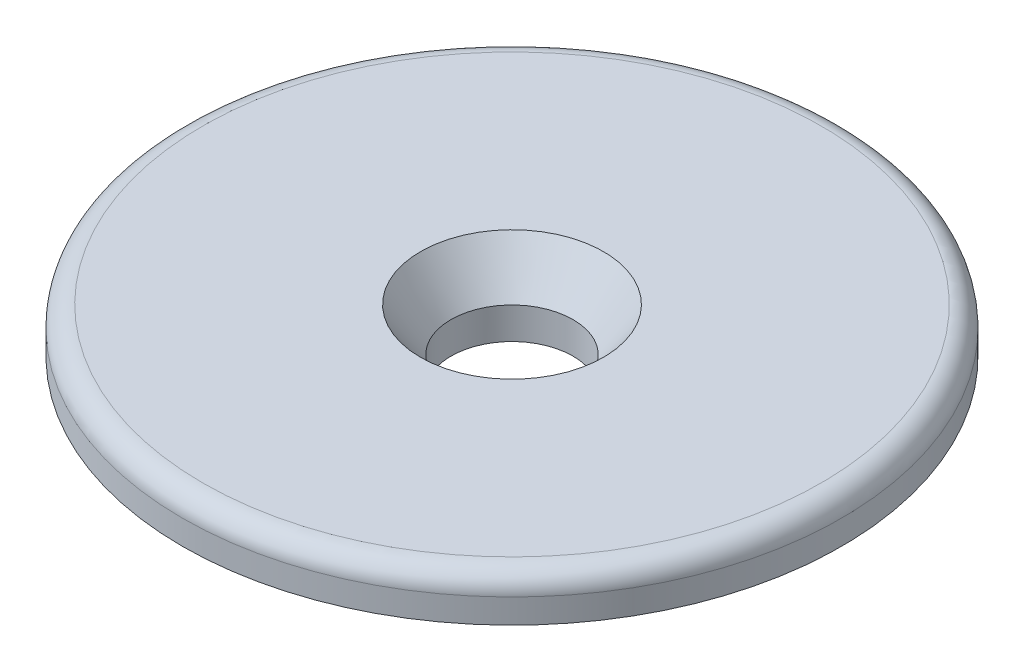
ISO-10303-21;
HEADER;
FILE_DESCRIPTION(('STEP AP214'),'2;1');
FILE_NAME('part.step','',(''),(''),'','','');
FILE_SCHEMA(('AUTOMOTIVE_DESIGN { 1 0 10303 214 1 1 1 1 }'));
ENDSEC;
DATA;
#1=APPLICATION_CONTEXT('core data for automotive mechanical design processes');
#2=APPLICATION_PROTOCOL_DEFINITION('international standard','automotive_design',2000,#1);
#3=PRODUCT_CONTEXT('',#1,'mechanical');
#4=PRODUCT('Part','Part','',(#3));
#5=PRODUCT_RELATED_PRODUCT_CATEGORY('part','',(#4));
#6=PRODUCT_DEFINITION_FORMATION('','',#4);
#7=PRODUCT_DEFINITION_CONTEXT('part definition',#1,'design');
#8=PRODUCT_DEFINITION('design','',#6,#7);
#9=PRODUCT_DEFINITION_SHAPE('','',#8);
#10=(LENGTH_UNIT() NAMED_UNIT(*) SI_UNIT(.MILLI.,.METRE.));
#11=(NAMED_UNIT(*) PLANE_ANGLE_UNIT() SI_UNIT($,.RADIAN.));
#12=(NAMED_UNIT(*) SI_UNIT($,.STERADIAN.) SOLID_ANGLE_UNIT());
#13=UNCERTAINTY_MEASURE_WITH_UNIT(LENGTH_MEASURE(1.E-05),#10,'distance_accuracy_value','');
#14=(GEOMETRIC_REPRESENTATION_CONTEXT(3) GLOBAL_UNCERTAINTY_ASSIGNED_CONTEXT((#13)) GLOBAL_UNIT_ASSIGNED_CONTEXT((#10,
#11,#12)) REPRESENTATION_CONTEXT('',''));
#15=CARTESIAN_POINT('',(0.,0.,0.));
#16=DIRECTION('',(0.,0.,1.));
#17=DIRECTION('',(1.,0.,0.));
#18=AXIS2_PLACEMENT_3D('',#15,#16,#17);
#19=CARTESIAN_POINT('',(0.,2.2,0.));
#20=DIRECTION('',(0.,1.,0.));
#21=DIRECTION('',(0.,0.,1.));
#22=AXIS2_PLACEMENT_3D('',#19,#20,#21);
#23=PLANE('',#22);
#24=CARTESIAN_POINT('',(0.,2.2,0.));
#25=DIRECTION('',(0.,1.,0.));
#26=DIRECTION('',(0.,0.,1.));
#27=AXIS2_PLACEMENT_3D('',#24,#25,#26);
#28=CIRCLE('',#27,4.50000000000001);
#29=CARTESIAN_POINT('',(0.,2.2,4.50000000000001));
#30=VERTEX_POINT('',#29);
#31=EDGE_CURVE('E10',#30,#30,#28,.F.);
#32=ORIENTED_EDGE('',*,*,#31,.T.);
#33=EDGE_LOOP('',(#32));
#34=FACE_BOUND('',#33,.T.);
#35=CARTESIAN_POINT('',(0.,2.2,0.));
#36=DIRECTION('',(0.,1.,0.));
#37=DIRECTION('',(0.,0.,1.));
#38=AXIS2_PLACEMENT_3D('',#35,#36,#37);
#39=CIRCLE('',#38,15.2);
#40=CARTESIAN_POINT('',(0.,2.2,15.2));
#41=VERTEX_POINT('',#40);
#42=EDGE_CURVE('E57',#41,#41,#39,.T.);
#43=ORIENTED_EDGE('',*,*,#42,.T.);
#44=EDGE_LOOP('',(#43));
#45=FACE_BOUND('',#44,.T.);
#46=ADVANCED_FACE('F38',(#34,#45),#23,.T.);
#47=CARTESIAN_POINT('',(0.,0.,0.));
#48=DIRECTION('',(0.,1.,0.));
#49=DIRECTION('',(0.,0.,1.));
#50=AXIS2_PLACEMENT_3D('',#47,#48,#49);
#51=PLANE('',#50);
#52=CARTESIAN_POINT('',(0.,0.,0.));
#53=DIRECTION('',(0.,-1.,0.));
#54=DIRECTION('',(0.,0.,-1.));
#55=AXIS2_PLACEMENT_3D('',#52,#53,#54);
#56=CIRCLE('',#55,13.5);
#57=CARTESIAN_POINT('',(0.,0.,-13.5));
#58=VERTEX_POINT('',#57);
#59=EDGE_CURVE('E63',#58,#58,#56,.T.);
#60=ORIENTED_EDGE('',*,*,#59,.F.);
#61=EDGE_LOOP('',(#60));
#62=FACE_BOUND('',#61,.T.);
#63=CARTESIAN_POINT('',(0.,0.,0.));
#64=DIRECTION('',(0.,1.,0.));
#65=DIRECTION('',(0.,0.,1.));
#66=AXIS2_PLACEMENT_3D('',#63,#64,#65);
#67=CIRCLE('',#66,16.2);
#68=CARTESIAN_POINT('',(0.,0.,16.2));
#69=VERTEX_POINT('',#68);
#70=EDGE_CURVE('E64',#69,#69,#67,.T.);
#71=ORIENTED_EDGE('',*,*,#70,.F.);
#72=EDGE_LOOP('',(#71));
#73=FACE_BOUND('',#72,.T.);
#74=ADVANCED_FACE('F98',(#62,#73),#51,.F.);
#75=CARTESIAN_POINT('',(0.,2.2,0.));
#76=DIRECTION('',(0.,-1.,0.));
#77=DIRECTION('',(0.,0.,-1.));
#78=AXIS2_PLACEMENT_3D('',#75,#76,#77);
#79=CYLINDRICAL_SURFACE('',#78,16.2);
#80=CARTESIAN_POINT('',(0.,1.2,0.));
#81=DIRECTION('',(0.,1.,0.));
#82=DIRECTION('',(0.,0.,1.));
#83=AXIS2_PLACEMENT_3D('',#80,#81,#82);
#84=CIRCLE('',#83,16.2);
#85=CARTESIAN_POINT('',(0.,1.2,16.2));
#86=VERTEX_POINT('',#85);
#87=EDGE_CURVE('E52',#86,#86,#84,.F.);
#88=ORIENTED_EDGE('',*,*,#87,.T.);
#89=EDGE_LOOP('',(#88));
#90=FACE_BOUND('',#89,.T.);
#91=ORIENTED_EDGE('',*,*,#70,.T.);
#92=EDGE_LOOP('',(#91));
#93=FACE_BOUND('',#92,.T.);
#94=ADVANCED_FACE('F95',(#90,#93),#79,.T.);
#95=CARTESIAN_POINT('',(0.,2.2,0.));
#96=DIRECTION('',(0.,-1.,0.));
#97=DIRECTION('',(0.,0.,-1.));
#98=AXIS2_PLACEMENT_3D('',#95,#96,#97);
#99=CYLINDRICAL_SURFACE('',#98,3.);
#100=CARTESIAN_POINT('',(0.,0.0577779898868181,0.));
#101=DIRECTION('',(0.,1.,0.));
#102=DIRECTION('',(0.,0.,1.));
#103=AXIS2_PLACEMENT_3D('',#100,#101,#102);
#104=CIRCLE('',#103,3.);
#105=CARTESIAN_POINT('',(0.,0.0577779898868181,3.));
#106=VERTEX_POINT('',#105);
#107=EDGE_CURVE('E47',#106,#106,#104,.T.);
#108=ORIENTED_EDGE('',*,*,#107,.T.);
#109=EDGE_LOOP('',(#108));
#110=FACE_BOUND('',#109,.T.);
#111=CARTESIAN_POINT('',(0.,-1.5,0.));
#112=DIRECTION('',(0.,-1.,0.));
#113=DIRECTION('',(0.,0.,-1.));
#114=AXIS2_PLACEMENT_3D('',#111,#112,#113);
#115=CIRCLE('',#114,3.);
#116=CARTESIAN_POINT('',(0.,-1.5,-3.));
#117=VERTEX_POINT('',#116);
#118=EDGE_CURVE('E75',#117,#117,#115,.T.);
#119=ORIENTED_EDGE('',*,*,#118,.T.);
#120=EDGE_LOOP('',(#119));
#121=FACE_BOUND('',#120,.T.);
#122=ADVANCED_FACE('F80',(#110,#121),#99,.F.);
#123=CARTESIAN_POINT('',(0.,-1.5,0.));
#124=DIRECTION('',(0.,-1.,0.));
#125=DIRECTION('',(0.,0.,-1.));
#126=AXIS2_PLACEMENT_3D('',#123,#124,#125);
#127=PLANE('',#126);
#128=CARTESIAN_POINT('',(0.,-1.5,0.));
#129=DIRECTION('',(0.,-1.,0.));
#130=DIRECTION('',(0.,0.,-1.));
#131=AXIS2_PLACEMENT_3D('',#128,#129,#130);
#132=CIRCLE('',#131,13.5);
#133=CARTESIAN_POINT('',(0.,-1.5,-13.5));
#134=VERTEX_POINT('',#133);
#135=EDGE_CURVE('E68',#134,#134,#132,.T.);
#136=ORIENTED_EDGE('',*,*,#135,.T.);
#137=EDGE_LOOP('',(#136));
#138=FACE_BOUND('',#137,.T.);
#139=ORIENTED_EDGE('',*,*,#118,.F.);
#140=EDGE_LOOP('',(#139));
#141=FACE_BOUND('',#140,.T.);
#142=ADVANCED_FACE('F82',(#138,#141),#127,.T.);
#143=CARTESIAN_POINT('',(0.,-1.5,0.));
#144=DIRECTION('',(0.,1.,0.));
#145=DIRECTION('',(0.,0.,1.));
#146=AXIS2_PLACEMENT_3D('',#143,#144,#145);
#147=CYLINDRICAL_SURFACE('',#146,13.5);
#148=ORIENTED_EDGE('',*,*,#135,.F.);
#149=EDGE_LOOP('',(#148));
#150=FACE_BOUND('',#149,.T.);
#151=ORIENTED_EDGE('',*,*,#59,.T.);
#152=EDGE_LOOP('',(#151));
#153=FACE_BOUND('',#152,.T.);
#154=ADVANCED_FACE('F84',(#150,#153),#147,.T.);
#155=CARTESIAN_POINT('',(0.,1.2,0.));
#156=DIRECTION('',(0.,1.,0.));
#157=DIRECTION('',(0.,0.,1.));
#158=AXIS2_PLACEMENT_3D('',#155,#156,#157);
#159=TOROIDAL_SURFACE('',#158,15.2,1.);
#160=ORIENTED_EDGE('',*,*,#87,.F.);
#161=EDGE_LOOP('',(#160));
#162=FACE_BOUND('',#161,.T.);
#163=ORIENTED_EDGE('',*,*,#42,.F.);
#164=EDGE_LOOP('',(#163));
#165=FACE_BOUND('',#164,.T.);
#166=ADVANCED_FACE('F91',(#162,#165),#159,.T.);
#167=CARTESIAN_POINT('',(0.,0.0577779898868181,0.));
#168=DIRECTION('',(0.,1.,0.));
#169=DIRECTION('',(0.,0.,1.));
#170=AXIS2_PLACEMENT_3D('',#167,#168,#169);
#171=CONICAL_SURFACE('',#170,3.,0.610865238198016);
#172=ORIENTED_EDGE('',*,*,#31,.F.);
#173=EDGE_LOOP('',(#172));
#174=FACE_BOUND('',#173,.T.);
#175=ORIENTED_EDGE('',*,*,#107,.F.);
#176=EDGE_LOOP('',(#175));
#177=FACE_BOUND('',#176,.T.);
#178=ADVANCED_FACE('F41',(#174,#177),#171,.F.);
#179=CLOSED_SHELL('',(#46,#74,#94,#122,#142,#154,#166,#178));
#180=MANIFOLD_SOLID_BREP('B2',#179);
#181=ADVANCED_BREP_SHAPE_REPRESENTATION('',(#18,#180),#14);
#182=SHAPE_DEFINITION_REPRESENTATION(#9,#181);
ENDSEC;
END-ISO-10303-21;
